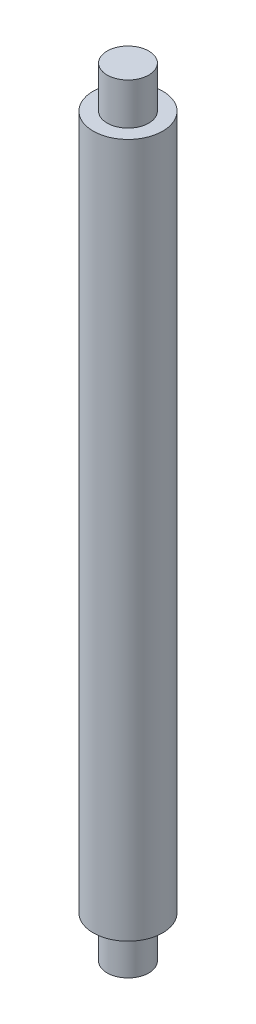
ISO-10303-21;
HEADER;
FILE_DESCRIPTION(('STEP AP214'),'2;1');
FILE_NAME('part.step','',(''),(''),'','','');
FILE_SCHEMA(('AUTOMOTIVE_DESIGN { 1 0 10303 214 1 1 1 1 }'));
ENDSEC;
DATA;
#1=APPLICATION_CONTEXT('core data for automotive mechanical design processes');
#2=APPLICATION_PROTOCOL_DEFINITION('international standard','automotive_design',2000,#1);
#3=PRODUCT_CONTEXT('',#1,'mechanical');
#4=PRODUCT('Part','Part','',(#3));
#5=PRODUCT_RELATED_PRODUCT_CATEGORY('part','',(#4));
#6=PRODUCT_DEFINITION_FORMATION('','',#4);
#7=PRODUCT_DEFINITION_CONTEXT('part definition',#1,'design');
#8=PRODUCT_DEFINITION('design','',#6,#7);
#9=PRODUCT_DEFINITION_SHAPE('','',#8);
#10=(LENGTH_UNIT() NAMED_UNIT(*) SI_UNIT(.MILLI.,.METRE.));
#11=(NAMED_UNIT(*) PLANE_ANGLE_UNIT() SI_UNIT($,.RADIAN.));
#12=(NAMED_UNIT(*) SI_UNIT($,.STERADIAN.) SOLID_ANGLE_UNIT());
#13=UNCERTAINTY_MEASURE_WITH_UNIT(LENGTH_MEASURE(1.E-05),#10,'distance_accuracy_value','');
#14=(GEOMETRIC_REPRESENTATION_CONTEXT(3) GLOBAL_UNCERTAINTY_ASSIGNED_CONTEXT((#13)) GLOBAL_UNIT_ASSIGNED_CONTEXT((#10,
#11,#12)) REPRESENTATION_CONTEXT('',''));
#15=CARTESIAN_POINT('',(0.,0.,0.));
#16=DIRECTION('',(0.,0.,1.));
#17=DIRECTION('',(1.,0.,0.));
#18=AXIS2_PLACEMENT_3D('',#15,#16,#17);
#19=CARTESIAN_POINT('',(0.,-25.,0.));
#20=DIRECTION('',(0.,1.,0.));
#21=DIRECTION('',(0.,0.,1.));
#22=AXIS2_PLACEMENT_3D('',#19,#20,#21);
#23=CYLINDRICAL_SURFACE('',#22,2.5);
#24=CARTESIAN_POINT('',(0.,-25.,0.));
#25=DIRECTION('',(0.,1.,0.));
#26=DIRECTION('',(0.,0.,1.));
#27=AXIS2_PLACEMENT_3D('',#24,#25,#26);
#28=CIRCLE('',#27,2.5);
#29=CARTESIAN_POINT('',(0.,-25.,2.5));
#30=VERTEX_POINT('',#29);
#31=EDGE_CURVE('E51',#30,#30,#28,.T.);
#32=ORIENTED_EDGE('',*,*,#31,.T.);
#33=EDGE_LOOP('',(#32));
#34=FACE_BOUND('',#33,.T.);
#35=CARTESIAN_POINT('',(0.,25.,0.));
#36=DIRECTION('',(0.,1.,0.));
#37=DIRECTION('',(0.,0.,1.));
#38=AXIS2_PLACEMENT_3D('',#35,#36,#37);
#39=CIRCLE('',#38,2.5);
#40=CARTESIAN_POINT('',(0.,25.,2.5));
#41=VERTEX_POINT('',#40);
#42=EDGE_CURVE('E42',#41,#41,#39,.T.);
#43=ORIENTED_EDGE('',*,*,#42,.F.);
#44=EDGE_LOOP('',(#43));
#45=FACE_BOUND('',#44,.T.);
#46=ADVANCED_FACE('F39',(#34,#45),#23,.T.);
#47=CARTESIAN_POINT('',(0.,-25.,0.));
#48=DIRECTION('',(0.,1.,0.));
#49=DIRECTION('',(0.,0.,1.));
#50=AXIS2_PLACEMENT_3D('',#47,#48,#49);
#51=PLANE('',#50);
#52=CARTESIAN_POINT('',(0.,-25.,0.));
#53=DIRECTION('',(0.,-1.,0.));
#54=DIRECTION('',(0.,0.,-1.));
#55=AXIS2_PLACEMENT_3D('',#52,#53,#54);
#56=CIRCLE('',#55,1.5);
#57=CARTESIAN_POINT('',(0.,-25.,-1.5));
#58=VERTEX_POINT('',#57);
#59=EDGE_CURVE('E10',#58,#58,#56,.T.);
#60=ORIENTED_EDGE('',*,*,#59,.F.);
#61=EDGE_LOOP('',(#60));
#62=FACE_BOUND('',#61,.T.);
#63=ORIENTED_EDGE('',*,*,#31,.F.);
#64=EDGE_LOOP('',(#63));
#65=FACE_BOUND('',#64,.T.);
#66=ADVANCED_FACE('F67',(#62,#65),#51,.F.);
#67=CARTESIAN_POINT('',(0.,25.,0.));
#68=DIRECTION('',(0.,1.,0.));
#69=DIRECTION('',(0.,0.,1.));
#70=AXIS2_PLACEMENT_3D('',#67,#68,#69);
#71=PLANE('',#70);
#72=CARTESIAN_POINT('',(0.,25.,0.));
#73=DIRECTION('',(0.,1.,0.));
#74=DIRECTION('',(0.,0.,1.));
#75=AXIS2_PLACEMENT_3D('',#72,#73,#74);
#76=CIRCLE('',#75,1.5);
#77=CARTESIAN_POINT('',(0.,25.,1.5));
#78=VERTEX_POINT('',#77);
#79=EDGE_CURVE('E46',#78,#78,#76,.T.);
#80=ORIENTED_EDGE('',*,*,#79,.F.);
#81=EDGE_LOOP('',(#80));
#82=FACE_BOUND('',#81,.T.);
#83=ORIENTED_EDGE('',*,*,#42,.T.);
#84=EDGE_LOOP('',(#83));
#85=FACE_BOUND('',#84,.T.);
#86=ADVANCED_FACE('F64',(#82,#85),#71,.T.);
#87=CARTESIAN_POINT('',(0.,28.,0.));
#88=DIRECTION('',(0.,-1.,0.));
#89=DIRECTION('',(0.,0.,-1.));
#90=AXIS2_PLACEMENT_3D('',#87,#88,#89);
#91=CYLINDRICAL_SURFACE('',#90,1.5);
#92=CARTESIAN_POINT('',(0.,28.,0.));
#93=DIRECTION('',(0.,1.,0.));
#94=DIRECTION('',(0.,0.,1.));
#95=AXIS2_PLACEMENT_3D('',#92,#93,#94);
#96=CIRCLE('',#95,1.5);
#97=CARTESIAN_POINT('',(0.,28.,1.5));
#98=VERTEX_POINT('',#97);
#99=EDGE_CURVE('E56',#98,#98,#96,.T.);
#100=ORIENTED_EDGE('',*,*,#99,.F.);
#101=EDGE_LOOP('',(#100));
#102=FACE_BOUND('',#101,.T.);
#103=ORIENTED_EDGE('',*,*,#79,.T.);
#104=EDGE_LOOP('',(#103));
#105=FACE_BOUND('',#104,.T.);
#106=ADVANCED_FACE('F76',(#102,#105),#91,.T.);
#107=CARTESIAN_POINT('',(0.,28.,0.));
#108=DIRECTION('',(0.,1.,0.));
#109=DIRECTION('',(0.,0.,1.));
#110=AXIS2_PLACEMENT_3D('',#107,#108,#109);
#111=PLANE('',#110);
#112=ORIENTED_EDGE('',*,*,#99,.T.);
#113=EDGE_LOOP('',(#112));
#114=FACE_BOUND('',#113,.T.);
#115=ADVANCED_FACE('F82',(#114),#111,.T.);
#116=CARTESIAN_POINT('',(0.,-28.,0.));
#117=DIRECTION('',(0.,1.,0.));
#118=DIRECTION('',(0.,0.,1.));
#119=AXIS2_PLACEMENT_3D('',#116,#117,#118);
#120=CYLINDRICAL_SURFACE('',#119,1.5);
#121=CARTESIAN_POINT('',(0.,-28.,0.));
#122=DIRECTION('',(0.,-1.,0.));
#123=DIRECTION('',(0.,0.,-1.));
#124=AXIS2_PLACEMENT_3D('',#121,#122,#123);
#125=CIRCLE('',#124,1.5);
#126=CARTESIAN_POINT('',(0.,-28.,-1.5));
#127=VERTEX_POINT('',#126);
#128=EDGE_CURVE('E55',#127,#127,#125,.T.);
#129=ORIENTED_EDGE('',*,*,#128,.F.);
#130=EDGE_LOOP('',(#129));
#131=FACE_BOUND('',#130,.T.);
#132=ORIENTED_EDGE('',*,*,#59,.T.);
#133=EDGE_LOOP('',(#132));
#134=FACE_BOUND('',#133,.T.);
#135=ADVANCED_FACE('F86',(#131,#134),#120,.T.);
#136=CARTESIAN_POINT('',(0.,-28.,0.));
#137=DIRECTION('',(0.,-1.,0.));
#138=DIRECTION('',(0.,0.,-1.));
#139=AXIS2_PLACEMENT_3D('',#136,#137,#138);
#140=PLANE('',#139);
#141=ORIENTED_EDGE('',*,*,#128,.T.);
#142=EDGE_LOOP('',(#141));
#143=FACE_BOUND('',#142,.T.);
#144=ADVANCED_FACE('F90',(#143),#140,.T.);
#145=CLOSED_SHELL('',(#46,#66,#86,#106,#115,#135,#144));
#146=MANIFOLD_SOLID_BREP('B2',#145);
#147=ADVANCED_BREP_SHAPE_REPRESENTATION('',(#18,#146),#14);
#148=SHAPE_DEFINITION_REPRESENTATION(#9,#147);
ENDSEC;
END-ISO-10303-21;
